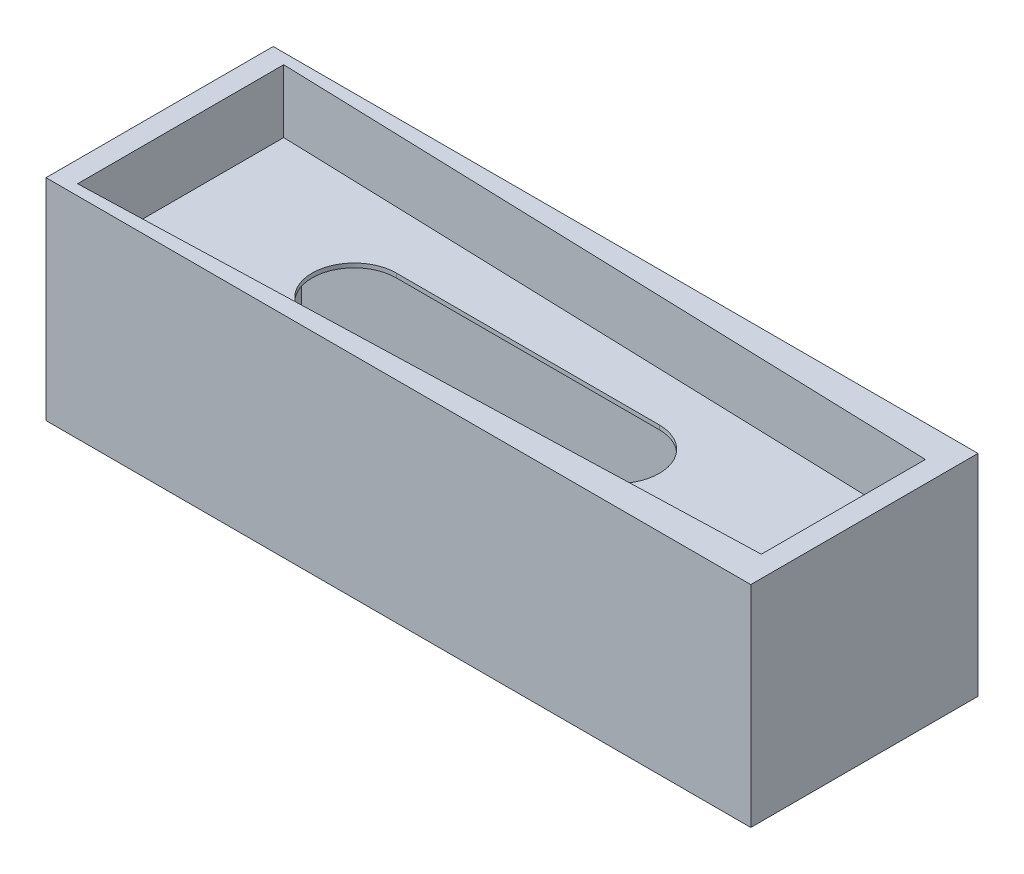
ISO-10303-21;
HEADER;
FILE_DESCRIPTION(('STEP AP214'),'2;1');
FILE_NAME('part.step','',(''),(''),'','','');
FILE_SCHEMA(('AUTOMOTIVE_DESIGN { 1 0 10303 214 1 1 1 1 }'));
ENDSEC;
DATA;
#1=APPLICATION_CONTEXT('core data for automotive mechanical design processes');
#2=APPLICATION_PROTOCOL_DEFINITION('international standard','automotive_design',2000,#1);
#3=PRODUCT_CONTEXT('',#1,'mechanical');
#4=PRODUCT('Part','Part','',(#3));
#5=PRODUCT_RELATED_PRODUCT_CATEGORY('part','',(#4));
#6=PRODUCT_DEFINITION_FORMATION('','',#4);
#7=PRODUCT_DEFINITION_CONTEXT('part definition',#1,'design');
#8=PRODUCT_DEFINITION('design','',#6,#7);
#9=PRODUCT_DEFINITION_SHAPE('','',#8);
#10=(LENGTH_UNIT() NAMED_UNIT(*) SI_UNIT(.MILLI.,.METRE.));
#11=(NAMED_UNIT(*) PLANE_ANGLE_UNIT() SI_UNIT($,.RADIAN.));
#12=(NAMED_UNIT(*) SI_UNIT($,.STERADIAN.) SOLID_ANGLE_UNIT());
#13=UNCERTAINTY_MEASURE_WITH_UNIT(LENGTH_MEASURE(1.E-05),#10,'distance_accuracy_value','');
#14=(GEOMETRIC_REPRESENTATION_CONTEXT(3) GLOBAL_UNCERTAINTY_ASSIGNED_CONTEXT((#13)) GLOBAL_UNIT_ASSIGNED_CONTEXT((#10,
#11,#12)) REPRESENTATION_CONTEXT('',''));
#15=CARTESIAN_POINT('',(0.,0.,0.));
#16=DIRECTION('',(0.,0.,1.));
#17=DIRECTION('',(1.,0.,0.));
#18=AXIS2_PLACEMENT_3D('',#15,#16,#17);
#19=CARTESIAN_POINT('',(0.,-100.,0.));
#20=DIRECTION('',(0.,1.,0.));
#21=DIRECTION('',(0.,0.,1.));
#22=AXIS2_PLACEMENT_3D('',#19,#20,#21);
#23=PLANE('',#22);
#24=DIRECTION('',(0.,0.,-1.));
#25=VECTOR('',#24,1.);
#26=CARTESIAN_POINT('',(167.5,-100.,-54.));
#27=LINE('',#26,#25);
#28=CARTESIAN_POINT('',(167.5,-100.,54.));
#29=VERTEX_POINT('',#28);
#30=CARTESIAN_POINT('',(167.5,-100.,-54.));
#31=VERTEX_POINT('',#30);
#32=EDGE_CURVE('E240',#29,#31,#27,.T.);
#33=ORIENTED_EDGE('',*,*,#32,.F.);
#34=DIRECTION('',(1.,0.,0.));
#35=VECTOR('',#34,1.);
#36=CARTESIAN_POINT('',(-167.5,-100.,54.));
#37=LINE('',#36,#35);
#38=CARTESIAN_POINT('',(-167.5,-100.,54.));
#39=VERTEX_POINT('',#38);
#40=EDGE_CURVE('E250',#39,#29,#37,.T.);
#41=ORIENTED_EDGE('',*,*,#40,.F.);
#42=DIRECTION('',(0.,0.,1.));
#43=VECTOR('',#42,1.);
#44=CARTESIAN_POINT('',(-167.5,-100.,-54.));
#45=LINE('',#44,#43);
#46=CARTESIAN_POINT('',(-167.5,-100.,-54.));
#47=VERTEX_POINT('',#46);
#48=EDGE_CURVE('E247',#47,#39,#45,.T.);
#49=ORIENTED_EDGE('',*,*,#48,.F.);
#50=DIRECTION('',(-1.,0.,0.));
#51=VECTOR('',#50,1.);
#52=CARTESIAN_POINT('',(-167.5,-100.,-54.));
#53=LINE('',#52,#51);
#54=EDGE_CURVE('E243',#31,#47,#53,.T.);
#55=ORIENTED_EDGE('',*,*,#54,.F.);
#56=EDGE_LOOP('',(#33,#41,#49,#55));
#57=FACE_BOUND('',#56,.T.);
#58=DIRECTION('',(1.,0.,0.));
#59=VECTOR('',#58,1.);
#60=CARTESIAN_POINT('',(-150.,-100.,50.));
#61=LINE('',#60,#59);
#62=CARTESIAN_POINT('',(-150.,-100.,50.));
#63=VERTEX_POINT('',#62);
#64=CARTESIAN_POINT('',(150.,-100.,50.));
#65=VERTEX_POINT('',#64);
#66=EDGE_CURVE('E172',#63,#65,#61,.T.);
#67=ORIENTED_EDGE('',*,*,#66,.T.);
#68=DIRECTION('',(0.,0.,-1.));
#69=VECTOR('',#68,1.);
#70=CARTESIAN_POINT('',(150.,-100.,50.));
#71=LINE('',#70,#69);
#72=CARTESIAN_POINT('',(150.,-100.,-50.));
#73=VERTEX_POINT('',#72);
#74=EDGE_CURVE('E190',#65,#73,#71,.T.);
#75=ORIENTED_EDGE('',*,*,#74,.T.);
#76=DIRECTION('',(1.,0.,0.));
#77=VECTOR('',#76,1.);
#78=CARTESIAN_POINT('',(-150.,-100.,-50.));
#79=LINE('',#78,#77);
#80=CARTESIAN_POINT('',(-150.,-100.,-50.));
#81=VERTEX_POINT('',#80);
#82=EDGE_CURVE('E193',#81,#73,#79,.T.);
#83=ORIENTED_EDGE('',*,*,#82,.F.);
#84=DIRECTION('',(0.,0.,-1.));
#85=VECTOR('',#84,1.);
#86=CARTESIAN_POINT('',(-150.,-100.,50.));
#87=LINE('',#86,#85);
#88=EDGE_CURVE('E179',#63,#81,#87,.T.);
#89=ORIENTED_EDGE('',*,*,#88,.F.);
#90=EDGE_LOOP('',(#67,#75,#83,#89));
#91=FACE_BOUND('',#90,.T.);
#92=ADVANCED_FACE('F33',(#57,#91),#23,.F.);
#93=CARTESIAN_POINT('',(0.,0.,0.));
#94=DIRECTION('',(0.,1.,0.));
#95=DIRECTION('',(0.,0.,1.));
#96=AXIS2_PLACEMENT_3D('',#93,#94,#95);
#97=PLANE('',#96);
#98=DIRECTION('',(0.,0.,-1.));
#99=VECTOR('',#98,1.);
#100=CARTESIAN_POINT('',(167.5,0.,-54.));
#101=LINE('',#100,#99);
#102=CARTESIAN_POINT('',(167.5,0.,54.));
#103=VERTEX_POINT('',#102);
#104=CARTESIAN_POINT('',(167.5,0.,-54.));
#105=VERTEX_POINT('',#104);
#106=EDGE_CURVE('E239',#103,#105,#101,.T.);
#107=ORIENTED_EDGE('',*,*,#106,.T.);
#108=DIRECTION('',(-1.,0.,0.));
#109=VECTOR('',#108,1.);
#110=CARTESIAN_POINT('',(-167.5,0.,-54.));
#111=LINE('',#110,#109);
#112=CARTESIAN_POINT('',(-167.5,0.,-54.));
#113=VERTEX_POINT('',#112);
#114=EDGE_CURVE('E256',#105,#113,#111,.T.);
#115=ORIENTED_EDGE('',*,*,#114,.T.);
#116=DIRECTION('',(0.,0.,1.));
#117=VECTOR('',#116,1.);
#118=CARTESIAN_POINT('',(-167.5,0.,-54.));
#119=LINE('',#118,#117);
#120=CARTESIAN_POINT('',(-167.5,0.,54.));
#121=VERTEX_POINT('',#120);
#122=EDGE_CURVE('E259',#113,#121,#119,.T.);
#123=ORIENTED_EDGE('',*,*,#122,.T.);
#124=DIRECTION('',(1.,0.,0.));
#125=VECTOR('',#124,1.);
#126=CARTESIAN_POINT('',(-167.5,0.,54.));
#127=LINE('',#126,#125);
#128=EDGE_CURVE('E244',#121,#103,#127,.T.);
#129=ORIENTED_EDGE('',*,*,#128,.T.);
#130=EDGE_LOOP('',(#107,#115,#123,#129));
#131=FACE_BOUND('',#130,.T.);
#132=DIRECTION('',(-0.999496475295367,0.,0.0317300468347736));
#133=VECTOR('',#132,1.);
#134=CARTESIAN_POINT('',(157.5,0.,39.));
#135=LINE('',#134,#133);
#136=CARTESIAN_POINT('',(157.5,0.,39.));
#137=VERTEX_POINT('',#136);
#138=CARTESIAN_POINT('',(-157.5,0.,49.));
#139=VERTEX_POINT('',#138);
#140=EDGE_CURVE('E212',#137,#139,#135,.T.);
#141=ORIENTED_EDGE('',*,*,#140,.T.);
#142=DIRECTION('',(0.,0.,-1.));
#143=VECTOR('',#142,1.);
#144=CARTESIAN_POINT('',(-157.5,0.,49.));
#145=LINE('',#144,#143);
#146=CARTESIAN_POINT('',(-157.5,0.,-49.));
#147=VERTEX_POINT('',#146);
#148=EDGE_CURVE('E207',#139,#147,#145,.T.);
#149=ORIENTED_EDGE('',*,*,#148,.T.);
#150=DIRECTION('',(0.999496475295367,0.,0.0317300468347736));
#151=VECTOR('',#150,1.);
#152=CARTESIAN_POINT('',(-157.5,0.,-49.));
#153=LINE('',#152,#151);
#154=CARTESIAN_POINT('',(157.5,0.,-39.));
#155=VERTEX_POINT('',#154);
#156=EDGE_CURVE('E222',#147,#155,#153,.T.);
#157=ORIENTED_EDGE('',*,*,#156,.T.);
#158=DIRECTION('',(0.,0.,-1.));
#159=VECTOR('',#158,1.);
#160=CARTESIAN_POINT('',(157.5,0.,39.));
#161=LINE('',#160,#159);
#162=EDGE_CURVE('E225',#137,#155,#161,.T.);
#163=ORIENTED_EDGE('',*,*,#162,.F.);
#164=EDGE_LOOP('',(#141,#149,#157,#163));
#165=FACE_BOUND('',#164,.T.);
#166=ADVANCED_FACE('F292',(#131,#165),#97,.T.);
#167=CARTESIAN_POINT('',(167.5,-100.,-54.));
#168=DIRECTION('',(1.,0.,0.));
#169=DIRECTION('',(0.,0.,-1.));
#170=AXIS2_PLACEMENT_3D('',#167,#168,#169);
#171=PLANE('',#170);
#172=ORIENTED_EDGE('',*,*,#106,.F.);
#173=DIRECTION('',(0.,1.,0.));
#174=VECTOR('',#173,1.);
#175=CARTESIAN_POINT('',(167.5,-100.,54.));
#176=LINE('',#175,#174);
#177=EDGE_CURVE('E264',#29,#103,#176,.T.);
#178=ORIENTED_EDGE('',*,*,#177,.F.);
#179=ORIENTED_EDGE('',*,*,#32,.T.);
#180=DIRECTION('',(0.,1.,0.));
#181=VECTOR('',#180,1.);
#182=CARTESIAN_POINT('',(167.5,-100.,-54.));
#183=LINE('',#182,#181);
#184=EDGE_CURVE('E253',#31,#105,#183,.T.);
#185=ORIENTED_EDGE('',*,*,#184,.T.);
#186=EDGE_LOOP('',(#172,#178,#179,#185));
#187=FACE_BOUND('',#186,.T.);
#188=ADVANCED_FACE('F35',(#187),#171,.T.);
#189=CARTESIAN_POINT('',(-167.5,-100.,54.));
#190=DIRECTION('',(0.,0.,1.));
#191=DIRECTION('',(1.,0.,0.));
#192=AXIS2_PLACEMENT_3D('',#189,#190,#191);
#193=PLANE('',#192);
#194=ORIENTED_EDGE('',*,*,#128,.F.);
#195=DIRECTION('',(0.,1.,0.));
#196=VECTOR('',#195,1.);
#197=CARTESIAN_POINT('',(-167.5,-100.,54.));
#198=LINE('',#197,#196);
#199=EDGE_CURVE('E267',#39,#121,#198,.T.);
#200=ORIENTED_EDGE('',*,*,#199,.F.);
#201=ORIENTED_EDGE('',*,*,#40,.T.);
#202=ORIENTED_EDGE('',*,*,#177,.T.);
#203=EDGE_LOOP('',(#194,#200,#201,#202));
#204=FACE_BOUND('',#203,.T.);
#205=ADVANCED_FACE('F306',(#204),#193,.T.);
#206=CARTESIAN_POINT('',(-167.5,-100.,-54.));
#207=DIRECTION('',(-1.,0.,0.));
#208=DIRECTION('',(0.,0.,1.));
#209=AXIS2_PLACEMENT_3D('',#206,#207,#208);
#210=PLANE('',#209);
#211=ORIENTED_EDGE('',*,*,#122,.F.);
#212=DIRECTION('',(0.,1.,0.));
#213=VECTOR('',#212,1.);
#214=CARTESIAN_POINT('',(-167.5,-100.,-54.));
#215=LINE('',#214,#213);
#216=EDGE_CURVE('E269',#47,#113,#215,.T.);
#217=ORIENTED_EDGE('',*,*,#216,.F.);
#218=ORIENTED_EDGE('',*,*,#48,.T.);
#219=ORIENTED_EDGE('',*,*,#199,.T.);
#220=EDGE_LOOP('',(#211,#217,#218,#219));
#221=FACE_BOUND('',#220,.T.);
#222=ADVANCED_FACE('F309',(#221),#210,.T.);
#223=CARTESIAN_POINT('',(-167.5,-100.,-54.));
#224=DIRECTION('',(0.,0.,-1.));
#225=DIRECTION('',(-1.,0.,0.));
#226=AXIS2_PLACEMENT_3D('',#223,#224,#225);
#227=PLANE('',#226);
#228=ORIENTED_EDGE('',*,*,#114,.F.);
#229=ORIENTED_EDGE('',*,*,#184,.F.);
#230=ORIENTED_EDGE('',*,*,#54,.T.);
#231=ORIENTED_EDGE('',*,*,#216,.T.);
#232=EDGE_LOOP('',(#228,#229,#230,#231));
#233=FACE_BOUND('',#232,.T.);
#234=ADVANCED_FACE('F312',(#233),#227,.T.);
#235=CARTESIAN_POINT('',(-157.5,-30.,49.));
#236=DIRECTION('',(1.,0.,0.));
#237=DIRECTION('',(0.,0.,-1.));
#238=AXIS2_PLACEMENT_3D('',#235,#236,#237);
#239=PLANE('',#238);
#240=ORIENTED_EDGE('',*,*,#148,.F.);
#241=DIRECTION('',(0.,1.,0.));
#242=VECTOR('',#241,1.);
#243=CARTESIAN_POINT('',(-157.5,-30.,49.));
#244=LINE('',#243,#242);
#245=CARTESIAN_POINT('',(-157.5,-30.,49.));
#246=VERTEX_POINT('',#245);
#247=EDGE_CURVE('E219',#246,#139,#244,.T.);
#248=ORIENTED_EDGE('',*,*,#247,.F.);
#249=DIRECTION('',(0.,0.,-1.));
#250=VECTOR('',#249,1.);
#251=CARTESIAN_POINT('',(-157.5,-30.,49.));
#252=LINE('',#251,#250);
#253=CARTESIAN_POINT('',(-157.5,-30.,-49.));
#254=VERTEX_POINT('',#253);
#255=EDGE_CURVE('E208',#246,#254,#252,.T.);
#256=ORIENTED_EDGE('',*,*,#255,.T.);
#257=DIRECTION('',(0.,1.,0.));
#258=VECTOR('',#257,1.);
#259=CARTESIAN_POINT('',(-157.5,-30.,-49.));
#260=LINE('',#259,#258);
#261=EDGE_CURVE('E236',#254,#147,#260,.T.);
#262=ORIENTED_EDGE('',*,*,#261,.T.);
#263=EDGE_LOOP('',(#240,#248,#256,#262));
#264=FACE_BOUND('',#263,.T.);
#265=ADVANCED_FACE('F303',(#264),#239,.T.);
#266=CARTESIAN_POINT('',(-157.5,-30.,-49.));
#267=DIRECTION('',(-0.0317300468347736,0.,0.999496475295367));
#268=DIRECTION('',(0.999496475295367,0.,0.0317300468347736));
#269=AXIS2_PLACEMENT_3D('',#266,#267,#268);
#270=PLANE('',#269);
#271=ORIENTED_EDGE('',*,*,#156,.F.);
#272=ORIENTED_EDGE('',*,*,#261,.F.);
#273=DIRECTION('',(0.999496475295367,0.,0.0317300468347736));
#274=VECTOR('',#273,1.);
#275=CARTESIAN_POINT('',(-157.5,-30.,-49.));
#276=LINE('',#275,#274);
#277=CARTESIAN_POINT('',(157.5,-30.,-39.));
#278=VERTEX_POINT('',#277);
#279=EDGE_CURVE('E211',#254,#278,#276,.T.);
#280=ORIENTED_EDGE('',*,*,#279,.T.);
#281=DIRECTION('',(0.,1.,0.));
#282=VECTOR('',#281,1.);
#283=CARTESIAN_POINT('',(157.5,-30.,-39.));
#284=LINE('',#283,#282);
#285=EDGE_CURVE('E234',#278,#155,#284,.T.);
#286=ORIENTED_EDGE('',*,*,#285,.T.);
#287=EDGE_LOOP('',(#271,#272,#280,#286));
#288=FACE_BOUND('',#287,.T.);
#289=ADVANCED_FACE('F319',(#288),#270,.T.);
#290=CARTESIAN_POINT('',(157.5,-30.,39.));
#291=DIRECTION('',(1.,0.,0.));
#292=DIRECTION('',(0.,0.,-1.));
#293=AXIS2_PLACEMENT_3D('',#290,#291,#292);
#294=PLANE('',#293);
#295=ORIENTED_EDGE('',*,*,#162,.T.);
#296=ORIENTED_EDGE('',*,*,#285,.F.);
#297=DIRECTION('',(0.,0.,-1.));
#298=VECTOR('',#297,1.);
#299=CARTESIAN_POINT('',(157.5,-30.,39.));
#300=LINE('',#299,#298);
#301=CARTESIAN_POINT('',(157.5,-30.,39.));
#302=VERTEX_POINT('',#301);
#303=EDGE_CURVE('E214',#302,#278,#300,.T.);
#304=ORIENTED_EDGE('',*,*,#303,.F.);
#305=DIRECTION('',(0.,1.,0.));
#306=VECTOR('',#305,1.);
#307=CARTESIAN_POINT('',(157.5,-30.,39.));
#308=LINE('',#307,#306);
#309=EDGE_CURVE('E232',#302,#137,#308,.T.);
#310=ORIENTED_EDGE('',*,*,#309,.T.);
#311=EDGE_LOOP('',(#295,#296,#304,#310));
#312=FACE_BOUND('',#311,.T.);
#313=ADVANCED_FACE('F366',(#312),#294,.F.);
#314=CARTESIAN_POINT('',(157.5,-30.,39.));
#315=DIRECTION('',(-0.0317300468347736,0.,-0.999496475295367));
#316=DIRECTION('',(-0.999496475295367,0.,0.0317300468347736));
#317=AXIS2_PLACEMENT_3D('',#314,#315,#316);
#318=PLANE('',#317);
#319=ORIENTED_EDGE('',*,*,#140,.F.);
#320=ORIENTED_EDGE('',*,*,#309,.F.);
#321=DIRECTION('',(-0.999496475295367,0.,0.0317300468347736));
#322=VECTOR('',#321,1.);
#323=CARTESIAN_POINT('',(157.5,-30.,39.));
#324=LINE('',#323,#322);
#325=EDGE_CURVE('E217',#302,#246,#324,.T.);
#326=ORIENTED_EDGE('',*,*,#325,.T.);
#327=ORIENTED_EDGE('',*,*,#247,.T.);
#328=EDGE_LOOP('',(#319,#320,#326,#327));
#329=FACE_BOUND('',#328,.T.);
#330=ADVANCED_FACE('F375',(#329),#318,.T.);
#331=CARTESIAN_POINT('',(0.,-30.,0.));
#332=DIRECTION('',(0.,-1.,0.));
#333=DIRECTION('',(0.,0.,-1.));
#334=AXIS2_PLACEMENT_3D('',#331,#332,#333);
#335=PLANE('',#334);
#336=DIRECTION('',(1.,0.,0.));
#337=VECTOR('',#336,1.);
#338=CARTESIAN_POINT('',(-75.,-30.,20.));
#339=LINE('',#338,#337);
#340=CARTESIAN_POINT('',(-75.,-30.,20.));
#341=VERTEX_POINT('',#340);
#342=CARTESIAN_POINT('',(50.,-30.,20.));
#343=VERTEX_POINT('',#342);
#344=EDGE_CURVE('E158',#341,#343,#339,.T.);
#345=ORIENTED_EDGE('',*,*,#344,.F.);
#346=CARTESIAN_POINT('',(-75.,-30.,0.));
#347=DIRECTION('',(0.,1.,0.));
#348=DIRECTION('',(0.,0.,1.));
#349=AXIS2_PLACEMENT_3D('',#346,#347,#348);
#350=CIRCLE('',#349,20.);
#351=CARTESIAN_POINT('',(-75.,-30.,-20.));
#352=VERTEX_POINT('',#351);
#353=EDGE_CURVE('E48',#352,#341,#350,.T.);
#354=ORIENTED_EDGE('',*,*,#353,.F.);
#355=DIRECTION('',(-1.,0.,0.));
#356=VECTOR('',#355,1.);
#357=CARTESIAN_POINT('',(-75.,-30.,-20.));
#358=LINE('',#357,#356);
#359=CARTESIAN_POINT('',(50.,-30.,-20.));
#360=VERTEX_POINT('',#359);
#361=EDGE_CURVE('E165',#360,#352,#358,.T.);
#362=ORIENTED_EDGE('',*,*,#361,.F.);
#363=CARTESIAN_POINT('',(50.,-30.,0.));
#364=DIRECTION('',(0.,1.,0.));
#365=DIRECTION('',(0.,0.,1.));
#366=AXIS2_PLACEMENT_3D('',#363,#364,#365);
#367=CIRCLE('',#366,20.);
#368=EDGE_CURVE('E149',#343,#360,#367,.T.);
#369=ORIENTED_EDGE('',*,*,#368,.F.);
#370=EDGE_LOOP('',(#345,#354,#362,#369));
#371=FACE_BOUND('',#370,.T.);
#372=ORIENTED_EDGE('',*,*,#255,.F.);
#373=ORIENTED_EDGE('',*,*,#325,.F.);
#374=ORIENTED_EDGE('',*,*,#303,.T.);
#375=ORIENTED_EDGE('',*,*,#279,.F.);
#376=EDGE_LOOP('',(#372,#373,#374,#375));
#377=FACE_BOUND('',#376,.T.);
#378=ADVANCED_FACE('F162',(#371,#377),#335,.F.);
#379=CARTESIAN_POINT('',(-150.,-32.,50.));
#380=DIRECTION('',(0.,0.,-1.));
#381=DIRECTION('',(-1.,0.,0.));
#382=AXIS2_PLACEMENT_3D('',#379,#380,#381);
#383=PLANE('',#382);
#384=ORIENTED_EDGE('',*,*,#66,.F.);
#385=DIRECTION('',(0.,-1.,0.));
#386=VECTOR('',#385,1.);
#387=CARTESIAN_POINT('',(-150.,-32.,50.));
#388=LINE('',#387,#386);
#389=CARTESIAN_POINT('',(-150.,-32.,50.));
#390=VERTEX_POINT('',#389);
#391=EDGE_CURVE('E187',#390,#63,#388,.T.);
#392=ORIENTED_EDGE('',*,*,#391,.F.);
#393=DIRECTION('',(1.,0.,0.));
#394=VECTOR('',#393,1.);
#395=CARTESIAN_POINT('',(-150.,-32.,50.));
#396=LINE('',#395,#394);
#397=CARTESIAN_POINT('',(150.,-32.,50.));
#398=VERTEX_POINT('',#397);
#399=EDGE_CURVE('E175',#390,#398,#396,.T.);
#400=ORIENTED_EDGE('',*,*,#399,.T.);
#401=DIRECTION('',(0.,-1.,0.));
#402=VECTOR('',#401,1.);
#403=CARTESIAN_POINT('',(150.,-32.,50.));
#404=LINE('',#403,#402);
#405=EDGE_CURVE('E204',#398,#65,#404,.T.);
#406=ORIENTED_EDGE('',*,*,#405,.T.);
#407=EDGE_LOOP('',(#384,#392,#400,#406));
#408=FACE_BOUND('',#407,.T.);
#409=ADVANCED_FACE('F397',(#408),#383,.T.);
#410=CARTESIAN_POINT('',(150.,-32.,50.));
#411=DIRECTION('',(-1.,0.,0.));
#412=DIRECTION('',(0.,0.,1.));
#413=AXIS2_PLACEMENT_3D('',#410,#411,#412);
#414=PLANE('',#413);
#415=ORIENTED_EDGE('',*,*,#74,.F.);
#416=ORIENTED_EDGE('',*,*,#405,.F.);
#417=DIRECTION('',(0.,0.,-1.));
#418=VECTOR('',#417,1.);
#419=CARTESIAN_POINT('',(150.,-32.,50.));
#420=LINE('',#419,#418);
#421=CARTESIAN_POINT('',(150.,-32.,-50.));
#422=VERTEX_POINT('',#421);
#423=EDGE_CURVE('E178',#398,#422,#420,.T.);
#424=ORIENTED_EDGE('',*,*,#423,.T.);
#425=DIRECTION('',(0.,-1.,0.));
#426=VECTOR('',#425,1.);
#427=CARTESIAN_POINT('',(150.,-32.,-50.));
#428=LINE('',#427,#426);
#429=EDGE_CURVE('E202',#422,#73,#428,.T.);
#430=ORIENTED_EDGE('',*,*,#429,.T.);
#431=EDGE_LOOP('',(#415,#416,#424,#430));
#432=FACE_BOUND('',#431,.T.);
#433=ADVANCED_FACE('F401',(#432),#414,.T.);
#434=CARTESIAN_POINT('',(-150.,-32.,-50.));
#435=DIRECTION('',(0.,0.,-1.));
#436=DIRECTION('',(-1.,0.,0.));
#437=AXIS2_PLACEMENT_3D('',#434,#435,#436);
#438=PLANE('',#437);
#439=ORIENTED_EDGE('',*,*,#82,.T.);
#440=ORIENTED_EDGE('',*,*,#429,.F.);
#441=DIRECTION('',(1.,0.,0.));
#442=VECTOR('',#441,1.);
#443=CARTESIAN_POINT('',(-150.,-32.,-50.));
#444=LINE('',#443,#442);
#445=CARTESIAN_POINT('',(-150.,-32.,-50.));
#446=VERTEX_POINT('',#445);
#447=EDGE_CURVE('E181',#446,#422,#444,.T.);
#448=ORIENTED_EDGE('',*,*,#447,.F.);
#449=DIRECTION('',(0.,-1.,0.));
#450=VECTOR('',#449,1.);
#451=CARTESIAN_POINT('',(-150.,-32.,-50.));
#452=LINE('',#451,#450);
#453=EDGE_CURVE('E200',#446,#81,#452,.T.);
#454=ORIENTED_EDGE('',*,*,#453,.T.);
#455=EDGE_LOOP('',(#439,#440,#448,#454));
#456=FACE_BOUND('',#455,.T.);
#457=ADVANCED_FACE('F411',(#456),#438,.F.);
#458=CARTESIAN_POINT('',(-150.,-32.,50.));
#459=DIRECTION('',(-1.,0.,0.));
#460=DIRECTION('',(0.,0.,1.));
#461=AXIS2_PLACEMENT_3D('',#458,#459,#460);
#462=PLANE('',#461);
#463=ORIENTED_EDGE('',*,*,#88,.T.);
#464=ORIENTED_EDGE('',*,*,#453,.F.);
#465=DIRECTION('',(0.,0.,-1.));
#466=VECTOR('',#465,1.);
#467=CARTESIAN_POINT('',(-150.,-32.,50.));
#468=LINE('',#467,#466);
#469=EDGE_CURVE('E184',#390,#446,#468,.T.);
#470=ORIENTED_EDGE('',*,*,#469,.F.);
#471=ORIENTED_EDGE('',*,*,#391,.T.);
#472=EDGE_LOOP('',(#463,#464,#470,#471));
#473=FACE_BOUND('',#472,.T.);
#474=ADVANCED_FACE('F288',(#473),#462,.F.);
#475=CARTESIAN_POINT('',(0.,-32.,0.));
#476=DIRECTION('',(0.,1.,0.));
#477=DIRECTION('',(0.,0.,1.));
#478=AXIS2_PLACEMENT_3D('',#475,#476,#477);
#479=PLANE('',#478);
#480=DIRECTION('',(-1.,0.,0.));
#481=VECTOR('',#480,1.);
#482=CARTESIAN_POINT('',(0.,-32.,-20.));
#483=LINE('',#482,#481);
#484=CARTESIAN_POINT('',(50.,-32.,-20.));
#485=VERTEX_POINT('',#484);
#486=CARTESIAN_POINT('',(-75.,-32.,-20.));
#487=VERTEX_POINT('',#486);
#488=EDGE_CURVE('E41',#485,#487,#483,.T.);
#489=ORIENTED_EDGE('',*,*,#488,.T.);
#490=CARTESIAN_POINT('',(-75.,-32.,0.));
#491=DIRECTION('',(0.,1.,0.));
#492=DIRECTION('',(0.,0.,1.));
#493=AXIS2_PLACEMENT_3D('',#490,#491,#492);
#494=CIRCLE('',#493,20.);
#495=CARTESIAN_POINT('',(-75.,-32.,20.));
#496=VERTEX_POINT('',#495);
#497=EDGE_CURVE('E11',#487,#496,#494,.T.);
#498=ORIENTED_EDGE('',*,*,#497,.T.);
#499=DIRECTION('',(1.,0.,0.));
#500=VECTOR('',#499,1.);
#501=CARTESIAN_POINT('',(0.,-32.,20.));
#502=LINE('',#501,#500);
#503=CARTESIAN_POINT('',(50.,-32.,20.));
#504=VERTEX_POINT('',#503);
#505=EDGE_CURVE('E266',#496,#504,#502,.T.);
#506=ORIENTED_EDGE('',*,*,#505,.T.);
#507=CARTESIAN_POINT('',(50.,-32.,0.));
#508=DIRECTION('',(0.,1.,0.));
#509=DIRECTION('',(0.,0.,1.));
#510=AXIS2_PLACEMENT_3D('',#507,#508,#509);
#511=CIRCLE('',#510,20.);
#512=EDGE_CURVE('E152',#504,#485,#511,.T.);
#513=ORIENTED_EDGE('',*,*,#512,.T.);
#514=EDGE_LOOP('',(#489,#498,#506,#513));
#515=FACE_BOUND('',#514,.T.);
#516=ORIENTED_EDGE('',*,*,#399,.F.);
#517=ORIENTED_EDGE('',*,*,#469,.T.);
#518=ORIENTED_EDGE('',*,*,#447,.T.);
#519=ORIENTED_EDGE('',*,*,#423,.F.);
#520=EDGE_LOOP('',(#516,#517,#518,#519));
#521=FACE_BOUND('',#520,.T.);
#522=ADVANCED_FACE('F275',(#515,#521),#479,.F.);
#523=CARTESIAN_POINT('',(-75.,-61.,0.));
#524=DIRECTION('',(0.,1.,0.));
#525=DIRECTION('',(0.,0.,1.));
#526=AXIS2_PLACEMENT_3D('',#523,#524,#525);
#527=CYLINDRICAL_SURFACE('',#526,20.);
#528=DIRECTION('',(0.,1.,0.));
#529=VECTOR('',#528,1.);
#530=CARTESIAN_POINT('',(-75.,-61.,-20.));
#531=LINE('',#530,#529);
#532=EDGE_CURVE('E170',#487,#352,#531,.T.);
#533=ORIENTED_EDGE('',*,*,#532,.T.);
#534=ORIENTED_EDGE('',*,*,#353,.T.);
#535=DIRECTION('',(0.,1.,0.));
#536=VECTOR('',#535,1.);
#537=CARTESIAN_POINT('',(-75.,-61.,20.));
#538=LINE('',#537,#536);
#539=EDGE_CURVE('E155',#496,#341,#538,.T.);
#540=ORIENTED_EDGE('',*,*,#539,.F.);
#541=ORIENTED_EDGE('',*,*,#497,.F.);
#542=EDGE_LOOP('',(#533,#534,#540,#541));
#543=FACE_BOUND('',#542,.T.);
#544=ADVANCED_FACE('F280',(#543),#527,.F.);
#545=CARTESIAN_POINT('',(-75.,-61.,-20.));
#546=DIRECTION('',(0.,0.,-1.));
#547=DIRECTION('',(-1.,0.,0.));
#548=AXIS2_PLACEMENT_3D('',#545,#546,#547);
#549=PLANE('',#548);
#550=DIRECTION('',(0.,1.,0.));
#551=VECTOR('',#550,1.);
#552=CARTESIAN_POINT('',(50.,-61.,-20.));
#553=LINE('',#552,#551);
#554=EDGE_CURVE('E154',#485,#360,#553,.T.);
#555=ORIENTED_EDGE('',*,*,#554,.T.);
#556=ORIENTED_EDGE('',*,*,#361,.T.);
#557=ORIENTED_EDGE('',*,*,#532,.F.);
#558=ORIENTED_EDGE('',*,*,#488,.F.);
#559=EDGE_LOOP('',(#555,#556,#557,#558));
#560=FACE_BOUND('',#559,.T.);
#561=ADVANCED_FACE('F279',(#560),#549,.F.);
#562=CARTESIAN_POINT('',(50.,-61.,0.));
#563=DIRECTION('',(0.,1.,0.));
#564=DIRECTION('',(0.,0.,1.));
#565=AXIS2_PLACEMENT_3D('',#562,#563,#564);
#566=CYLINDRICAL_SURFACE('',#565,20.);
#567=DIRECTION('',(0.,1.,0.));
#568=VECTOR('',#567,1.);
#569=CARTESIAN_POINT('',(50.,-61.,20.));
#570=LINE('',#569,#568);
#571=EDGE_CURVE('E56',#504,#343,#570,.T.);
#572=ORIENTED_EDGE('',*,*,#571,.T.);
#573=ORIENTED_EDGE('',*,*,#368,.T.);
#574=ORIENTED_EDGE('',*,*,#554,.F.);
#575=ORIENTED_EDGE('',*,*,#512,.F.);
#576=EDGE_LOOP('',(#572,#573,#574,#575));
#577=FACE_BOUND('',#576,.T.);
#578=ADVANCED_FACE('F146',(#577),#566,.F.);
#579=CARTESIAN_POINT('',(-75.,-61.,20.));
#580=DIRECTION('',(0.,0.,1.));
#581=DIRECTION('',(1.,0.,0.));
#582=AXIS2_PLACEMENT_3D('',#579,#580,#581);
#583=PLANE('',#582);
#584=ORIENTED_EDGE('',*,*,#539,.T.);
#585=ORIENTED_EDGE('',*,*,#344,.T.);
#586=ORIENTED_EDGE('',*,*,#571,.F.);
#587=ORIENTED_EDGE('',*,*,#505,.F.);
#588=EDGE_LOOP('',(#584,#585,#586,#587));
#589=FACE_BOUND('',#588,.T.);
#590=ADVANCED_FACE('F159',(#589),#583,.F.);
#591=CLOSED_SHELL('',(#92,#166,#188,#205,#222,#234,#265,#289,#313,#330,#378,#409,#433,#457,#474,
#522,#544,#561,#578,#590));
#592=MANIFOLD_SOLID_BREP('B2',#591);
#593=ADVANCED_BREP_SHAPE_REPRESENTATION('',(#18,#592),#14);
#594=SHAPE_DEFINITION_REPRESENTATION(#9,#593);
ENDSEC;
END-ISO-10303-21;
